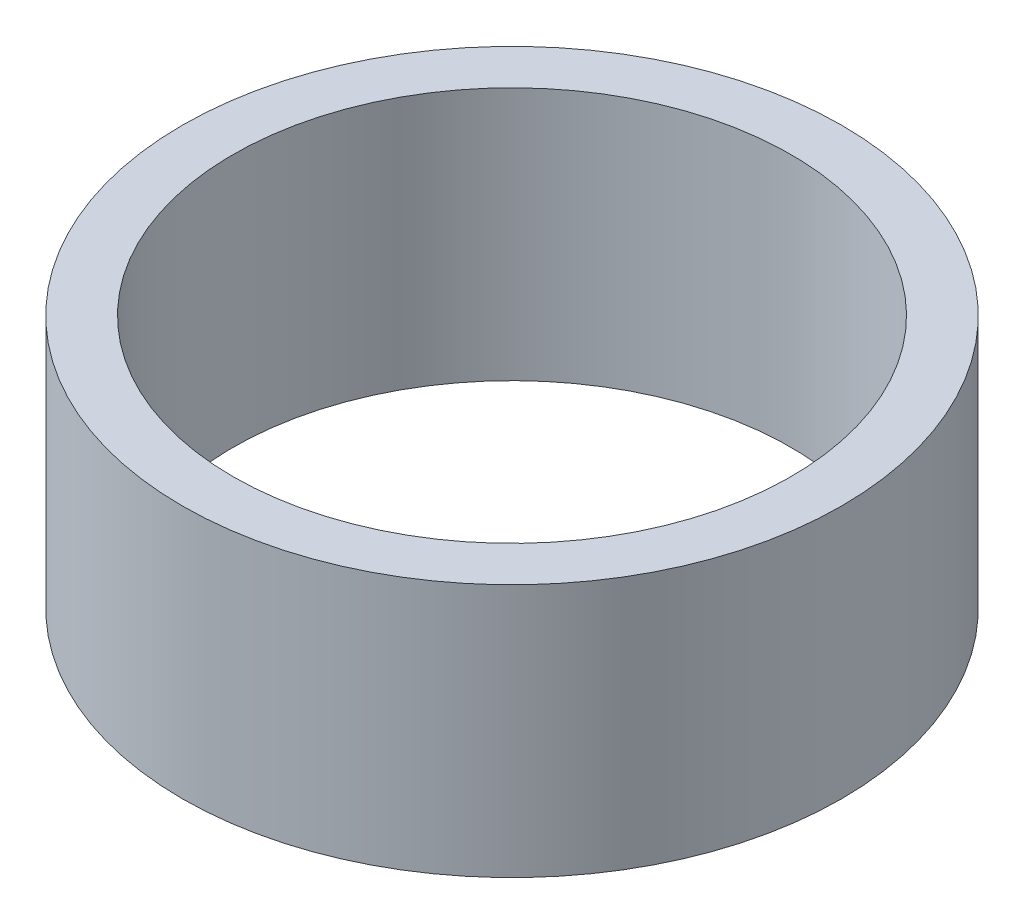
ISO-10303-21;
HEADER;
FILE_DESCRIPTION(('STEP AP214'),'2;1');
FILE_NAME('part.step','',(''),(''),'','','');
FILE_SCHEMA(('AUTOMOTIVE_DESIGN { 1 0 10303 214 1 1 1 1 }'));
ENDSEC;
DATA;
#1=APPLICATION_CONTEXT('core data for automotive mechanical design processes');
#2=APPLICATION_PROTOCOL_DEFINITION('international standard','automotive_design',2000,#1);
#3=PRODUCT_CONTEXT('',#1,'mechanical');
#4=PRODUCT('Part','Part','',(#3));
#5=PRODUCT_RELATED_PRODUCT_CATEGORY('part','',(#4));
#6=PRODUCT_DEFINITION_FORMATION('','',#4);
#7=PRODUCT_DEFINITION_CONTEXT('part definition',#1,'design');
#8=PRODUCT_DEFINITION('design','',#6,#7);
#9=PRODUCT_DEFINITION_SHAPE('','',#8);
#10=(LENGTH_UNIT() NAMED_UNIT(*) SI_UNIT(.MILLI.,.METRE.));
#11=(NAMED_UNIT(*) PLANE_ANGLE_UNIT() SI_UNIT($,.RADIAN.));
#12=(NAMED_UNIT(*) SI_UNIT($,.STERADIAN.) SOLID_ANGLE_UNIT());
#13=UNCERTAINTY_MEASURE_WITH_UNIT(LENGTH_MEASURE(1.E-05),#10,'distance_accuracy_value','');
#14=(GEOMETRIC_REPRESENTATION_CONTEXT(3) GLOBAL_UNCERTAINTY_ASSIGNED_CONTEXT((#13)) GLOBAL_UNIT_ASSIGNED_CONTEXT((#10,
#11,#12)) REPRESENTATION_CONTEXT('',''));
#15=CARTESIAN_POINT('',(0.,0.,0.));
#16=DIRECTION('',(0.,0.,1.));
#17=DIRECTION('',(1.,0.,0.));
#18=AXIS2_PLACEMENT_3D('',#15,#16,#17);
#19=CARTESIAN_POINT('',(0.,10.,0.));
#20=DIRECTION('',(0.,1.,0.));
#21=DIRECTION('',(0.,0.,1.));
#22=AXIS2_PLACEMENT_3D('',#19,#20,#21);
#23=PLANE('',#22);
#24=CARTESIAN_POINT('',(0.,10.,0.));
#25=DIRECTION('',(0.,1.,0.));
#26=DIRECTION('',(0.,0.,1.));
#27=AXIS2_PLACEMENT_3D('',#24,#25,#26);
#28=CIRCLE('',#27,13.);
#29=CARTESIAN_POINT('',(0.,10.,13.));
#30=VERTEX_POINT('',#29);
#31=EDGE_CURVE('E10',#30,#30,#28,.T.);
#32=ORIENTED_EDGE('',*,*,#31,.T.);
#33=EDGE_LOOP('',(#32));
#34=FACE_BOUND('',#33,.T.);
#35=CARTESIAN_POINT('',(0.,10.,0.));
#36=DIRECTION('',(0.,1.,0.));
#37=DIRECTION('',(0.,0.,1.));
#38=AXIS2_PLACEMENT_3D('',#35,#36,#37);
#39=CIRCLE('',#38,11.);
#40=CARTESIAN_POINT('',(0.,10.,11.));
#41=VERTEX_POINT('',#40);
#42=EDGE_CURVE('E42',#41,#41,#39,.T.);
#43=ORIENTED_EDGE('',*,*,#42,.F.);
#44=EDGE_LOOP('',(#43));
#45=FACE_BOUND('',#44,.T.);
#46=ADVANCED_FACE('F31',(#34,#45),#23,.T.);
#47=CARTESIAN_POINT('',(0.,0.,0.));
#48=DIRECTION('',(0.,1.,0.));
#49=DIRECTION('',(0.,0.,1.));
#50=AXIS2_PLACEMENT_3D('',#47,#48,#49);
#51=PLANE('',#50);
#52=CARTESIAN_POINT('',(0.,0.,0.));
#53=DIRECTION('',(0.,1.,0.));
#54=DIRECTION('',(0.,0.,1.));
#55=AXIS2_PLACEMENT_3D('',#52,#53,#54);
#56=CIRCLE('',#55,13.);
#57=CARTESIAN_POINT('',(0.,0.,13.));
#58=VERTEX_POINT('',#57);
#59=EDGE_CURVE('E35',#58,#58,#56,.T.);
#60=ORIENTED_EDGE('',*,*,#59,.F.);
#61=EDGE_LOOP('',(#60));
#62=FACE_BOUND('',#61,.T.);
#63=CARTESIAN_POINT('',(0.,0.,0.));
#64=DIRECTION('',(0.,1.,0.));
#65=DIRECTION('',(0.,0.,1.));
#66=AXIS2_PLACEMENT_3D('',#63,#64,#65);
#67=CIRCLE('',#66,11.);
#68=CARTESIAN_POINT('',(0.,0.,11.));
#69=VERTEX_POINT('',#68);
#70=EDGE_CURVE('E44',#69,#69,#67,.T.);
#71=ORIENTED_EDGE('',*,*,#70,.T.);
#72=EDGE_LOOP('',(#71));
#73=FACE_BOUND('',#72,.T.);
#74=ADVANCED_FACE('F54',(#62,#73),#51,.F.);
#75=CARTESIAN_POINT('',(0.,10.,0.));
#76=DIRECTION('',(0.,-1.,0.));
#77=DIRECTION('',(0.,0.,-1.));
#78=AXIS2_PLACEMENT_3D('',#75,#76,#77);
#79=CYLINDRICAL_SURFACE('',#78,13.);
#80=ORIENTED_EDGE('',*,*,#31,.F.);
#81=EDGE_LOOP('',(#80));
#82=FACE_BOUND('',#81,.T.);
#83=ORIENTED_EDGE('',*,*,#59,.T.);
#84=EDGE_LOOP('',(#83));
#85=FACE_BOUND('',#84,.T.);
#86=ADVANCED_FACE('F33',(#82,#85),#79,.T.);
#87=CARTESIAN_POINT('',(0.,10.,0.));
#88=DIRECTION('',(0.,-1.,0.));
#89=DIRECTION('',(0.,0.,-1.));
#90=AXIS2_PLACEMENT_3D('',#87,#88,#89);
#91=CYLINDRICAL_SURFACE('',#90,11.);
#92=ORIENTED_EDGE('',*,*,#42,.T.);
#93=EDGE_LOOP('',(#92));
#94=FACE_BOUND('',#93,.T.);
#95=ORIENTED_EDGE('',*,*,#70,.F.);
#96=EDGE_LOOP('',(#95));
#97=FACE_BOUND('',#96,.T.);
#98=ADVANCED_FACE('F50',(#94,#97),#91,.F.);
#99=CLOSED_SHELL('',(#46,#74,#86,#98));
#100=MANIFOLD_SOLID_BREP('B2',#99);
#101=ADVANCED_BREP_SHAPE_REPRESENTATION('',(#18,#100),#14);
#102=SHAPE_DEFINITION_REPRESENTATION(#9,#101);
ENDSEC;
END-ISO-10303-21;
